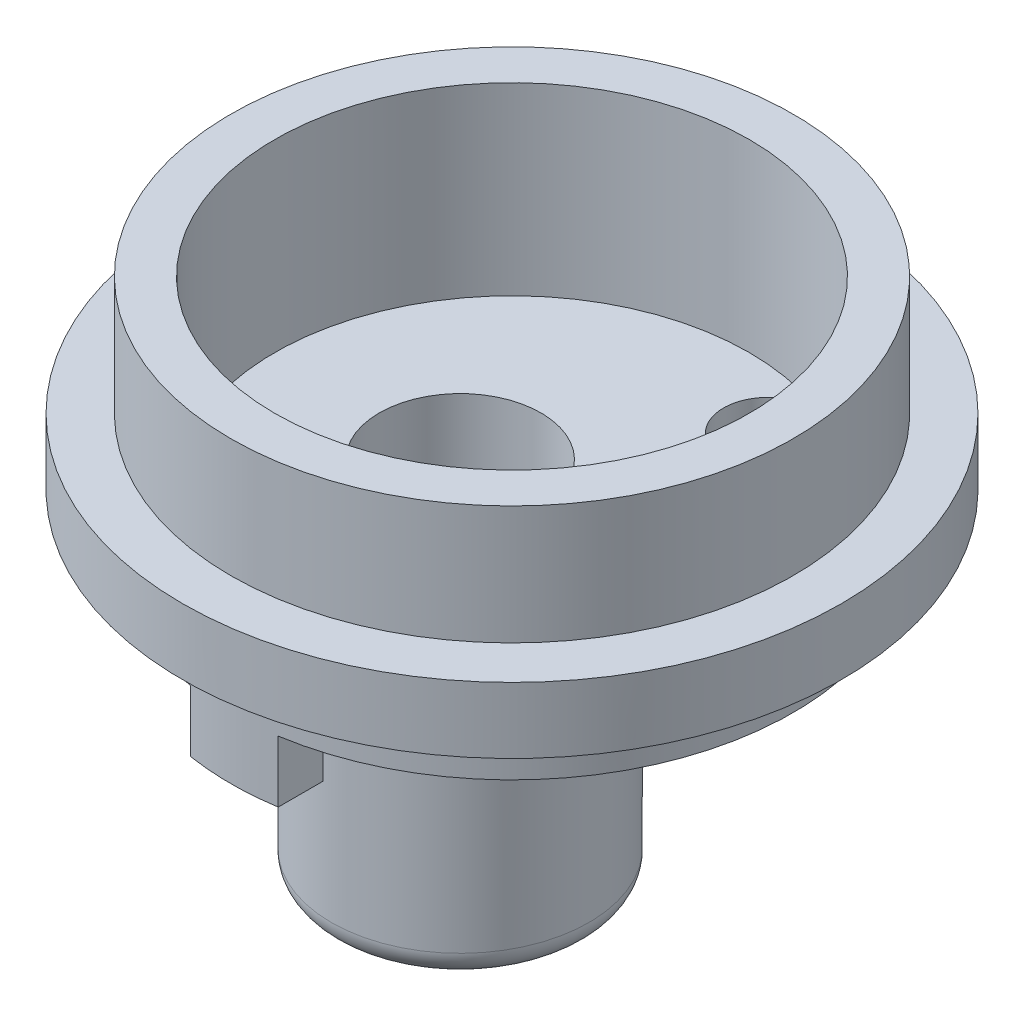
ISO-10303-21;
HEADER;
FILE_DESCRIPTION(('STEP AP214'),'2;1');
FILE_NAME('part.step','',(''),(''),'','','');
FILE_SCHEMA(('AUTOMOTIVE_DESIGN { 1 0 10303 214 1 1 1 1 }'));
ENDSEC;
DATA;
#1=APPLICATION_CONTEXT('core data for automotive mechanical design processes');
#2=APPLICATION_PROTOCOL_DEFINITION('international standard','automotive_design',2000,#1);
#3=PRODUCT_CONTEXT('',#1,'mechanical');
#4=PRODUCT('Part','Part','',(#3));
#5=PRODUCT_RELATED_PRODUCT_CATEGORY('part','',(#4));
#6=PRODUCT_DEFINITION_FORMATION('','',#4);
#7=PRODUCT_DEFINITION_CONTEXT('part definition',#1,'design');
#8=PRODUCT_DEFINITION('design','',#6,#7);
#9=PRODUCT_DEFINITION_SHAPE('','',#8);
#10=(LENGTH_UNIT() NAMED_UNIT(*) SI_UNIT(.MILLI.,.METRE.));
#11=(NAMED_UNIT(*) PLANE_ANGLE_UNIT() SI_UNIT($,.RADIAN.));
#12=(NAMED_UNIT(*) SI_UNIT($,.STERADIAN.) SOLID_ANGLE_UNIT());
#13=UNCERTAINTY_MEASURE_WITH_UNIT(LENGTH_MEASURE(1.E-05),#10,'distance_accuracy_value','');
#14=(GEOMETRIC_REPRESENTATION_CONTEXT(3) GLOBAL_UNCERTAINTY_ASSIGNED_CONTEXT((#13)) GLOBAL_UNIT_ASSIGNED_CONTEXT((#10,
#11,#12)) REPRESENTATION_CONTEXT('',''));
#15=CARTESIAN_POINT('',(0.,0.,0.));
#16=DIRECTION('',(0.,0.,1.));
#17=DIRECTION('',(1.,0.,0.));
#18=AXIS2_PLACEMENT_3D('',#15,#16,#17);
#19=CARTESIAN_POINT('',(0.,0.,0.));
#20=DIRECTION('',(0.,1.,0.));
#21=DIRECTION('',(0.,0.,1.));
#22=AXIS2_PLACEMENT_3D('',#19,#20,#21);
#23=PLANE('',#22);
#24=CARTESIAN_POINT('',(-1.4986,0.,0.));
#25=DIRECTION('',(0.,1.,0.));
#26=DIRECTION('',(0.,0.,1.));
#27=AXIS2_PLACEMENT_3D('',#24,#25,#26);
#28=CIRCLE('',#27,5.08);
#29=CARTESIAN_POINT('',(0.567898775765487,0.,4.64068775180573));
#30=VERTEX_POINT('',#29);
#31=CARTESIAN_POINT('',(0.567898775765488,0.,-4.64068775180573));
#32=VERTEX_POINT('',#31);
#33=EDGE_CURVE('E260',#30,#32,#28,.F.);
#34=ORIENTED_EDGE('',*,*,#33,.F.);
#35=CARTESIAN_POINT('',(2.28578474576272,0.,5.09911091230996));
#36=DIRECTION('',(0.,1.,0.));
#37=DIRECTION('',(0.,0.,1.));
#38=AXIS2_PLACEMENT_3D('',#35,#36,#37);
#39=CIRCLE('',#38,1.778);
#40=CARTESIAN_POINT('',(3.01307989214176,0.,6.72155529349949));
#41=VERTEX_POINT('',#40);
#42=EDGE_CURVE('E277',#30,#41,#39,.T.);
#43=ORIENTED_EDGE('',*,*,#42,.T.);
#44=CARTESIAN_POINT('',(0.,0.,0.));
#45=DIRECTION('',(0.,1.,0.));
#46=DIRECTION('',(0.,0.,1.));
#47=AXIS2_PLACEMENT_3D('',#44,#45,#46);
#48=CIRCLE('',#47,7.366);
#49=CARTESIAN_POINT('',(3.01307989214176,0.,-6.72155529349949));
#50=VERTEX_POINT('',#49);
#51=EDGE_CURVE('E273',#41,#50,#48,.T.);
#52=ORIENTED_EDGE('',*,*,#51,.T.);
#53=CARTESIAN_POINT('',(2.28578474576272,0.,-5.09911091230995));
#54=DIRECTION('',(0.,1.,0.));
#55=DIRECTION('',(0.,0.,1.));
#56=AXIS2_PLACEMENT_3D('',#53,#54,#55);
#57=CIRCLE('',#56,1.778);
#58=EDGE_CURVE('E275',#50,#32,#57,.T.);
#59=ORIENTED_EDGE('',*,*,#58,.T.);
#60=EDGE_LOOP('',(#34,#43,#52,#59));
#61=FACE_BOUND('',#60,.T.);
#62=CARTESIAN_POINT('',(0.,0.,0.));
#63=DIRECTION('',(0.,-1.,0.));
#64=DIRECTION('',(0.,0.,-1.));
#65=AXIS2_PLACEMENT_3D('',#62,#63,#64);
#66=CIRCLE('',#65,6.858);
#67=CARTESIAN_POINT('',(-1.27,0.,-6.73938157400217));
#68=VERTEX_POINT('',#67);
#69=CARTESIAN_POINT('',(1.27,0.,-6.73938157400217));
#70=VERTEX_POINT('',#69);
#71=EDGE_CURVE('E172',#68,#70,#66,.T.);
#72=ORIENTED_EDGE('',*,*,#71,.T.);
#73=DIRECTION('',(0.,0.,-1.));
#74=VECTOR('',#73,1.);
#75=CARTESIAN_POINT('',(1.27,0.,-6.73938157400217));
#76=LINE('',#75,#74);
#77=CARTESIAN_POINT('',(1.27,0.,-8.02816815967379));
#78=VERTEX_POINT('',#77);
#79=EDGE_CURVE('E170',#70,#78,#76,.T.);
#80=ORIENTED_EDGE('',*,*,#79,.T.);
#81=CARTESIAN_POINT('',(0.,0.,0.));
#82=DIRECTION('',(0.,1.,0.));
#83=DIRECTION('',(0.,0.,1.));
#84=AXIS2_PLACEMENT_3D('',#81,#82,#83);
#85=CIRCLE('',#84,8.128);
#86=CARTESIAN_POINT('',(1.27,0.,8.02816815967379));
#87=VERTEX_POINT('',#86);
#88=EDGE_CURVE('E156',#87,#78,#85,.T.);
#89=ORIENTED_EDGE('',*,*,#88,.F.);
#90=DIRECTION('',(0.,0.,-1.));
#91=VECTOR('',#90,1.);
#92=CARTESIAN_POINT('',(1.27,0.,8.02816815967379));
#93=LINE('',#92,#91);
#94=CARTESIAN_POINT('',(1.27,0.,6.73938157400217));
#95=VERTEX_POINT('',#94);
#96=EDGE_CURVE('E186',#87,#95,#93,.T.);
#97=ORIENTED_EDGE('',*,*,#96,.T.);
#98=CARTESIAN_POINT('',(0.,0.,0.));
#99=DIRECTION('',(0.,-1.,0.));
#100=DIRECTION('',(0.,0.,-1.));
#101=AXIS2_PLACEMENT_3D('',#98,#99,#100);
#102=CIRCLE('',#101,6.858);
#103=CARTESIAN_POINT('',(-1.27,0.,6.73938157400217));
#104=VERTEX_POINT('',#103);
#105=EDGE_CURVE('E197',#95,#104,#102,.T.);
#106=ORIENTED_EDGE('',*,*,#105,.T.);
#107=DIRECTION('',(0.,0.,-1.));
#108=VECTOR('',#107,1.);
#109=CARTESIAN_POINT('',(-1.27,0.,8.02816815967379));
#110=LINE('',#109,#108);
#111=CARTESIAN_POINT('',(-1.27,0.,8.02816815967379));
#112=VERTEX_POINT('',#111);
#113=EDGE_CURVE('E160',#112,#104,#110,.T.);
#114=ORIENTED_EDGE('',*,*,#113,.F.);
#115=CARTESIAN_POINT('',(-1.27,0.,-8.02816815967379));
#116=VERTEX_POINT('',#115);
#117=EDGE_CURVE('E255',#116,#112,#85,.T.);
#118=ORIENTED_EDGE('',*,*,#117,.F.);
#119=DIRECTION('',(0.,0.,-1.));
#120=VECTOR('',#119,1.);
#121=CARTESIAN_POINT('',(-1.27,0.,-6.73938157400217));
#122=LINE('',#121,#120);
#123=EDGE_CURVE('E149',#68,#116,#122,.T.);
#124=ORIENTED_EDGE('',*,*,#123,.F.);
#125=EDGE_LOOP('',(#72,#80,#89,#97,#106,#114,#118,#124));
#126=FACE_BOUND('',#125,.T.);
#127=ADVANCED_FACE('F36',(#61,#126),#23,.F.);
#128=CARTESIAN_POINT('',(0.,1.524,0.));
#129=DIRECTION('',(0.,-1.,0.));
#130=DIRECTION('',(0.,0.,-1.));
#131=AXIS2_PLACEMENT_3D('',#128,#129,#130);
#132=PLANE('',#131);
#133=CARTESIAN_POINT('',(-1.4986,1.524,0.));
#134=DIRECTION('',(0.,1.,0.));
#135=DIRECTION('',(-1.,0.,0.));
#136=AXIS2_PLACEMENT_3D('',#133,#134,#135);
#137=CIRCLE('',#136,2.33679999999999);
#138=CARTESIAN_POINT('',(-3.8354,1.524,0.));
#139=VERTEX_POINT('',#138);
#140=EDGE_CURVE('E227',#139,#139,#137,.T.);
#141=ORIENTED_EDGE('',*,*,#140,.F.);
#142=EDGE_LOOP('',(#141));
#143=FACE_BOUND('',#142,.T.);
#144=CARTESIAN_POINT('',(2.28578474576272,1.524,5.09911091230996));
#145=DIRECTION('',(0.,-1.,0.));
#146=DIRECTION('',(0.,0.,-1.));
#147=AXIS2_PLACEMENT_3D('',#144,#145,#146);
#148=CIRCLE('',#147,1.27);
#149=CARTESIAN_POINT('',(2.80528127889061,1.524,6.25799975601676));
#150=VERTEX_POINT('',#149);
#151=CARTESIAN_POINT('',(1.52890779661017,1.524,4.07928872984796));
#152=VERTEX_POINT('',#151);
#153=EDGE_CURVE('E210',#150,#152,#148,.T.);
#154=ORIENTED_EDGE('',*,*,#153,.T.);
#155=CARTESIAN_POINT('',(-1.4986,1.524,0.));
#156=DIRECTION('',(0.,1.,0.));
#157=DIRECTION('',(0.,0.,1.));
#158=AXIS2_PLACEMENT_3D('',#155,#156,#157);
#159=CIRCLE('',#158,5.08);
#160=CARTESIAN_POINT('',(1.52890779661017,1.524,-4.07928872984796));
#161=VERTEX_POINT('',#160);
#162=EDGE_CURVE('E213',#152,#161,#159,.T.);
#163=ORIENTED_EDGE('',*,*,#162,.T.);
#164=CARTESIAN_POINT('',(2.28578474576272,1.524,-5.09911091230995));
#165=DIRECTION('',(0.,1.,0.));
#166=DIRECTION('',(0.,0.,1.));
#167=AXIS2_PLACEMENT_3D('',#164,#165,#166);
#168=CIRCLE('',#167,1.27);
#169=CARTESIAN_POINT('',(2.80528127889061,1.524,-6.25799975601676));
#170=VERTEX_POINT('',#169);
#171=EDGE_CURVE('E216',#170,#161,#168,.T.);
#172=ORIENTED_EDGE('',*,*,#171,.F.);
#173=CARTESIAN_POINT('',(0.,1.524,0.));
#174=DIRECTION('',(0.,-1.,0.));
#175=DIRECTION('',(0.,0.,-1.));
#176=AXIS2_PLACEMENT_3D('',#173,#174,#175);
#177=CIRCLE('',#176,6.858);
#178=EDGE_CURVE('E239',#150,#170,#177,.T.);
#179=ORIENTED_EDGE('',*,*,#178,.F.);
#180=EDGE_LOOP('',(#154,#163,#172,#179));
#181=FACE_BOUND('',#180,.T.);
#182=ADVANCED_FACE('F314',(#143,#181),#132,.F.);
#183=CARTESIAN_POINT('',(0.,6.858,0.));
#184=DIRECTION('',(0.,-1.,0.));
#185=DIRECTION('',(0.,0.,-1.));
#186=AXIS2_PLACEMENT_3D('',#183,#184,#185);
#187=CYLINDRICAL_SURFACE('',#186,8.128);
#188=CARTESIAN_POINT('',(0.,1.524,0.));
#189=DIRECTION('',(0.,-1.,0.));
#190=DIRECTION('',(0.,0.,-1.));
#191=AXIS2_PLACEMENT_3D('',#188,#189,#190);
#192=CIRCLE('',#191,8.128);
#193=CARTESIAN_POINT('',(0.,1.524,-8.128));
#194=VERTEX_POINT('',#193);
#195=EDGE_CURVE('E251',#194,#194,#192,.T.);
#196=ORIENTED_EDGE('',*,*,#195,.T.);
#197=EDGE_LOOP('',(#196));
#198=FACE_BOUND('',#197,.T.);
#199=ORIENTED_EDGE('',*,*,#88,.T.);
#200=DIRECTION('',(0.,1.,0.));
#201=VECTOR('',#200,1.);
#202=CARTESIAN_POINT('',(1.27,-1.778,-8.02816815967379));
#203=LINE('',#202,#201);
#204=CARTESIAN_POINT('',(1.27,-1.778,-8.02816815967379));
#205=VERTEX_POINT('',#204);
#206=EDGE_CURVE('E152',#205,#78,#203,.T.);
#207=ORIENTED_EDGE('',*,*,#206,.F.);
#208=CARTESIAN_POINT('',(0.,-1.778,0.));
#209=DIRECTION('',(0.,-1.,0.));
#210=DIRECTION('',(0.,0.,-1.));
#211=AXIS2_PLACEMENT_3D('',#208,#209,#210);
#212=CIRCLE('',#211,8.128);
#213=CARTESIAN_POINT('',(-1.27,-1.778,-8.02816815967379));
#214=VERTEX_POINT('',#213);
#215=EDGE_CURVE('E138',#214,#205,#212,.T.);
#216=ORIENTED_EDGE('',*,*,#215,.F.);
#217=DIRECTION('',(0.,1.,0.));
#218=VECTOR('',#217,1.);
#219=CARTESIAN_POINT('',(-1.27,-1.778,-8.02816815967379));
#220=LINE('',#219,#218);
#221=EDGE_CURVE('E169',#214,#116,#220,.T.);
#222=ORIENTED_EDGE('',*,*,#221,.T.);
#223=ORIENTED_EDGE('',*,*,#117,.T.);
#224=DIRECTION('',(0.,1.,0.));
#225=VECTOR('',#224,1.);
#226=CARTESIAN_POINT('',(-1.27,-1.778,8.02816815967379));
#227=LINE('',#226,#225);
#228=CARTESIAN_POINT('',(-1.27,-1.778,8.02816815967379));
#229=VERTEX_POINT('',#228);
#230=EDGE_CURVE('E207',#229,#112,#227,.T.);
#231=ORIENTED_EDGE('',*,*,#230,.F.);
#232=CARTESIAN_POINT('',(0.,-1.778,0.));
#233=DIRECTION('',(0.,-1.,0.));
#234=DIRECTION('',(0.,0.,-1.));
#235=AXIS2_PLACEMENT_3D('',#232,#233,#234);
#236=CIRCLE('',#235,8.128);
#237=CARTESIAN_POINT('',(1.27,-1.778,8.02816815967379));
#238=VERTEX_POINT('',#237);
#239=EDGE_CURVE('E182',#238,#229,#236,.T.);
#240=ORIENTED_EDGE('',*,*,#239,.F.);
#241=DIRECTION('',(0.,1.,0.));
#242=VECTOR('',#241,1.);
#243=CARTESIAN_POINT('',(1.27,-1.778,8.02816815967379));
#244=LINE('',#243,#242);
#245=EDGE_CURVE('E194',#238,#87,#244,.T.);
#246=ORIENTED_EDGE('',*,*,#245,.T.);
#247=EDGE_LOOP('',(#199,#207,#216,#222,#223,#231,#240,#246));
#248=FACE_BOUND('',#247,.T.);
#249=ADVANCED_FACE('F153',(#198,#248),#187,.T.);
#250=CARTESIAN_POINT('',(-1.4986,-2.54,0.));
#251=DIRECTION('',(0.,1.,0.));
#252=DIRECTION('',(0.,0.,1.));
#253=AXIS2_PLACEMENT_3D('',#250,#251,#252);
#254=CYLINDRICAL_SURFACE('',#253,5.08);
#255=DIRECTION('',(0.,1.,0.));
#256=VECTOR('',#255,1.);
#257=CARTESIAN_POINT('',(1.52890779661017,-8.9662,4.07928872984796));
#258=LINE('',#257,#256);
#259=CARTESIAN_POINT('',(1.52890779661017,0.508,4.07928872984796));
#260=VERTEX_POINT('',#259);
#261=EDGE_CURVE('E225',#260,#152,#258,.T.);
#262=ORIENTED_EDGE('',*,*,#261,.F.);
#263=CARTESIAN_POINT('',(0.567898775765488,0.,4.64068775180573));
#264=CARTESIAN_POINT('',(0.618864964756393,5.12373952471222E-05,4.61801161541345));
#265=CARTESIAN_POINT('',(0.669077863503208,0.00553166204909815,4.59462833172186));
#266=CARTESIAN_POINT('',(0.766715495825451,0.0249706184832816,4.54726271334381));
#267=CARTESIAN_POINT('',(0.814169285684297,0.038810230688748,4.52329322552336));
#268=CARTESIAN_POINT('',(0.941170085100346,0.0854665664421088,4.45671525964496));
#269=CARTESIAN_POINT('',(1.01800450523612,0.124727188123649,4.41365014820112));
#270=CARTESIAN_POINT('',(1.16492275554147,0.21424231053805,4.32659484056449));
#271=CARTESIAN_POINT('',(1.23494680683312,0.264583360923871,4.28259997503994));
#272=CARTESIAN_POINT('',(1.37918595530417,0.377555296614401,4.18726831558202));
#273=CARTESIAN_POINT('',(1.45268033128906,0.44092690877456,4.13574536153834));
#274=CARTESIAN_POINT('',(1.52612075642525,0.505546294935492,4.08135604999621));
#275=CARTESIAN_POINT('',(1.52751454136693,0.506773155422019,4.08032273697647));
#276=CARTESIAN_POINT('',(1.52890779661017,0.508,4.07928872984796));
#277=B_SPLINE_CURVE_WITH_KNOTS('',3,(#263,#264,#265,#266,#267,#268,#269,#270,#271,#272,#273,
#274,#275,#276),.UNSPECIFIED.,.F.,.F.,(4,2,2,2,2,2,4),(0.,0.166504667171272,0.3306946298291,
0.618403010419728,0.908443915602081,1.23784315485636,1.24421810640599),.UNSPECIFIED.);
#278=EDGE_CURVE('E282',#260,#30,#277,.F.);
#279=ORIENTED_EDGE('',*,*,#278,.T.);
#280=ORIENTED_EDGE('',*,*,#33,.T.);
#281=CARTESIAN_POINT('',(0.567898775765488,0.,-4.64068775180573));
#282=CARTESIAN_POINT('',(0.618864964756394,5.12373952469472E-05,-4.61801161541345));
#283=CARTESIAN_POINT('',(0.66907786350321,0.00553166204909828,-4.59462833172186));
#284=CARTESIAN_POINT('',(0.766715495825454,0.0249706184832823,-4.54726271334381));
#285=CARTESIAN_POINT('',(0.814169285684299,0.0388102306887487,-4.52329322552336));
#286=CARTESIAN_POINT('',(0.941170085100345,0.0854665664421085,-4.45671525964496));
#287=CARTESIAN_POINT('',(1.01800450523612,0.124727188123647,-4.41365014820112));
#288=CARTESIAN_POINT('',(1.16492275554147,0.214242310538049,-4.32659484056449));
#289=CARTESIAN_POINT('',(1.23494680683311,0.264583360923875,-4.28259997503994));
#290=CARTESIAN_POINT('',(1.37918595530417,0.377555296614393,-4.18726831558202));
#291=CARTESIAN_POINT('',(1.45268033128907,0.440926908774531,-4.13574536153833));
#292=CARTESIAN_POINT('',(1.52612075642525,0.50554629493549,-4.08135604999621));
#293=CARTESIAN_POINT('',(1.52751454136693,0.506773155422018,-4.08032273697647));
#294=CARTESIAN_POINT('',(1.52890779661017,0.508,-4.07928872984796));
#295=B_SPLINE_CURVE_WITH_KNOTS('',3,(#281,#282,#283,#284,#285,#286,#287,#288,#289,#290,#291,
#292,#293,#294),.UNSPECIFIED.,.F.,.F.,(4,2,2,2,2,2,4),(0.,0.166504667171275,0.3306946298291,
0.618403010419724,0.908443915602075,1.23784315485636,1.24421810640599),.UNSPECIFIED.);
#296=CARTESIAN_POINT('',(1.52890779661017,0.508,-4.07928872984796));
#297=VERTEX_POINT('',#296);
#298=EDGE_CURVE('E51',#32,#297,#295,.T.);
#299=ORIENTED_EDGE('',*,*,#298,.T.);
#300=DIRECTION('',(0.,1.,0.));
#301=VECTOR('',#300,1.);
#302=CARTESIAN_POINT('',(1.52890779661017,-8.9662,-4.07928872984796));
#303=LINE('',#302,#301);
#304=EDGE_CURVE('E223',#297,#161,#303,.T.);
#305=ORIENTED_EDGE('',*,*,#304,.T.);
#306=ORIENTED_EDGE('',*,*,#162,.F.);
#307=EDGE_LOOP('',(#262,#279,#280,#299,#305,#306));
#308=FACE_BOUND('',#307,.T.);
#309=CARTESIAN_POINT('',(-1.4986,-2.54,0.));
#310=DIRECTION('',(0.,-1.,0.));
#311=DIRECTION('',(0.,0.,-1.));
#312=AXIS2_PLACEMENT_3D('',#309,#310,#311);
#313=CIRCLE('',#312,5.08);
#314=CARTESIAN_POINT('',(-1.4986,-2.54,-5.08));
#315=VERTEX_POINT('',#314);
#316=EDGE_CURVE('E252',#315,#315,#313,.T.);
#317=ORIENTED_EDGE('',*,*,#316,.F.);
#318=EDGE_LOOP('',(#317));
#319=FACE_BOUND('',#318,.T.);
#320=ADVANCED_FACE('F299',(#308,#319),#254,.T.);
#321=CARTESIAN_POINT('',(-1.4986,-2.54,0.));
#322=DIRECTION('',(0.,-1.,0.));
#323=DIRECTION('',(0.,0.,-1.));
#324=AXIS2_PLACEMENT_3D('',#321,#322,#323);
#325=PLANE('',#324);
#326=CARTESIAN_POINT('',(-1.4986,-2.54,0.));
#327=DIRECTION('',(0.,-1.,0.));
#328=DIRECTION('',(0.,0.,-1.));
#329=AXIS2_PLACEMENT_3D('',#326,#327,#328);
#330=CIRCLE('',#329,3.72467038944253);
#331=CARTESIAN_POINT('',(-1.4986,-2.54,-3.72467038944253));
#332=VERTEX_POINT('',#331);
#333=EDGE_CURVE('E263',#332,#332,#330,.T.);
#334=ORIENTED_EDGE('',*,*,#333,.F.);
#335=EDGE_LOOP('',(#334));
#336=FACE_BOUND('',#335,.T.);
#337=ORIENTED_EDGE('',*,*,#316,.T.);
#338=EDGE_LOOP('',(#337));
#339=FACE_BOUND('',#338,.T.);
#340=ADVANCED_FACE('F304',(#336,#339),#325,.T.);
#341=CARTESIAN_POINT('',(-1.4986,-8.9662,0.));
#342=DIRECTION('',(0.,1.,0.));
#343=DIRECTION('',(0.,0.,1.));
#344=AXIS2_PLACEMENT_3D('',#341,#342,#343);
#345=CYLINDRICAL_SURFACE('',#344,3.72467038944253);
#346=CARTESIAN_POINT('',(-1.4986,-8.2042,0.));
#347=DIRECTION('',(0.,1.,0.));
#348=DIRECTION('',(0.,0.,1.));
#349=AXIS2_PLACEMENT_3D('',#346,#347,#348);
#350=CIRCLE('',#349,3.72467038944253);
#351=CARTESIAN_POINT('',(-1.4986,-8.2042,3.72467038944253));
#352=VERTEX_POINT('',#351);
#353=EDGE_CURVE('E44',#352,#352,#350,.T.);
#354=ORIENTED_EDGE('',*,*,#353,.T.);
#355=EDGE_LOOP('',(#354));
#356=FACE_BOUND('',#355,.T.);
#357=ORIENTED_EDGE('',*,*,#333,.T.);
#358=EDGE_LOOP('',(#357));
#359=FACE_BOUND('',#358,.T.);
#360=ADVANCED_FACE('F349',(#356,#359),#345,.T.);
#361=CARTESIAN_POINT('',(-1.4986,-8.9662,0.));
#362=DIRECTION('',(0.,1.,0.));
#363=DIRECTION('',(0.,0.,1.));
#364=AXIS2_PLACEMENT_3D('',#361,#362,#363);
#365=PLANE('',#364);
#366=CARTESIAN_POINT('',(-1.4986,-8.9662,0.));
#367=DIRECTION('',(0.,1.,0.));
#368=DIRECTION('',(0.,0.,1.));
#369=AXIS2_PLACEMENT_3D('',#366,#367,#368);
#370=CIRCLE('',#369,2.96267038944253);
#371=CARTESIAN_POINT('',(-1.4986,-8.9662,2.96267038944253));
#372=VERTEX_POINT('',#371);
#373=EDGE_CURVE('E11',#372,#372,#370,.F.);
#374=ORIENTED_EDGE('',*,*,#373,.T.);
#375=EDGE_LOOP('',(#374));
#376=FACE_BOUND('',#375,.T.);
#377=CARTESIAN_POINT('',(-1.4986,-8.9662,0.));
#378=DIRECTION('',(0.,1.,0.));
#379=DIRECTION('',(-1.,0.,0.));
#380=AXIS2_PLACEMENT_3D('',#377,#378,#379);
#381=CIRCLE('',#380,1.9304);
#382=CARTESIAN_POINT('',(-3.429,-8.9662,0.));
#383=VERTEX_POINT('',#382);
#384=EDGE_CURVE('E230',#383,#383,#381,.T.);
#385=ORIENTED_EDGE('',*,*,#384,.T.);
#386=EDGE_LOOP('',(#385));
#387=FACE_BOUND('',#386,.T.);
#388=ADVANCED_FACE('F340',(#376,#387),#365,.F.);
#389=CARTESIAN_POINT('',(0.,3.429,0.));
#390=DIRECTION('',(0.,1.,0.));
#391=DIRECTION('',(0.,0.,1.));
#392=AXIS2_PLACEMENT_3D('',#389,#390,#391);
#393=PLANE('',#392);
#394=CARTESIAN_POINT('',(0.,3.429,0.));
#395=DIRECTION('',(0.,1.,0.));
#396=DIRECTION('',(0.,0.,1.));
#397=AXIS2_PLACEMENT_3D('',#394,#395,#396);
#398=CIRCLE('',#397,9.525);
#399=CARTESIAN_POINT('',(0.,3.429,9.525));
#400=VERTEX_POINT('',#399);
#401=EDGE_CURVE('E248',#400,#400,#398,.F.);
#402=ORIENTED_EDGE('',*,*,#401,.F.);
#403=EDGE_LOOP('',(#402));
#404=FACE_BOUND('',#403,.T.);
#405=CARTESIAN_POINT('',(0.,3.429,0.));
#406=DIRECTION('',(0.,1.,0.));
#407=DIRECTION('',(0.,0.,1.));
#408=AXIS2_PLACEMENT_3D('',#405,#406,#407);
#409=CIRCLE('',#408,8.128);
#410=CARTESIAN_POINT('',(0.,3.429,8.128));
#411=VERTEX_POINT('',#410);
#412=EDGE_CURVE('E256',#411,#411,#409,.T.);
#413=ORIENTED_EDGE('',*,*,#412,.F.);
#414=EDGE_LOOP('',(#413));
#415=FACE_BOUND('',#414,.T.);
#416=ADVANCED_FACE('F337',(#404,#415),#393,.T.);
#417=CARTESIAN_POINT('',(0.,1.524,0.));
#418=DIRECTION('',(0.,-1.,0.));
#419=DIRECTION('',(0.,0.,-1.));
#420=AXIS2_PLACEMENT_3D('',#417,#418,#419);
#421=PLANE('',#420);
#422=CARTESIAN_POINT('',(0.,1.524,0.));
#423=DIRECTION('',(0.,-1.,0.));
#424=DIRECTION('',(0.,0.,-1.));
#425=AXIS2_PLACEMENT_3D('',#422,#423,#424);
#426=CIRCLE('',#425,9.525);
#427=CARTESIAN_POINT('',(0.,1.524,-9.525));
#428=VERTEX_POINT('',#427);
#429=EDGE_CURVE('E243',#428,#428,#426,.T.);
#430=ORIENTED_EDGE('',*,*,#429,.T.);
#431=EDGE_LOOP('',(#430));
#432=FACE_BOUND('',#431,.T.);
#433=ORIENTED_EDGE('',*,*,#195,.F.);
#434=EDGE_LOOP('',(#433));
#435=FACE_BOUND('',#434,.T.);
#436=ADVANCED_FACE('F339',(#432,#435),#421,.T.);
#437=CARTESIAN_POINT('',(0.,33.7987683632075,0.));
#438=DIRECTION('',(0.,-1.,0.));
#439=DIRECTION('',(0.,0.,-1.));
#440=AXIS2_PLACEMENT_3D('',#437,#438,#439);
#441=CYLINDRICAL_SURFACE('',#440,9.525);
#442=ORIENTED_EDGE('',*,*,#429,.F.);
#443=EDGE_LOOP('',(#442));
#444=FACE_BOUND('',#443,.T.);
#445=ORIENTED_EDGE('',*,*,#401,.T.);
#446=EDGE_LOOP('',(#445));
#447=FACE_BOUND('',#446,.T.);
#448=ADVANCED_FACE('F311',(#444,#447),#441,.T.);
#449=CARTESIAN_POINT('',(0.,6.858,0.));
#450=DIRECTION('',(0.,1.,0.));
#451=DIRECTION('',(0.,0.,1.));
#452=AXIS2_PLACEMENT_3D('',#449,#450,#451);
#453=PLANE('',#452);
#454=CARTESIAN_POINT('',(0.,6.858,0.));
#455=DIRECTION('',(0.,-1.,0.));
#456=DIRECTION('',(0.,0.,-1.));
#457=AXIS2_PLACEMENT_3D('',#454,#455,#456);
#458=CIRCLE('',#457,6.858);
#459=CARTESIAN_POINT('',(0.,6.858,-6.858));
#460=VERTEX_POINT('',#459);
#461=EDGE_CURVE('E240',#460,#460,#458,.T.);
#462=ORIENTED_EDGE('',*,*,#461,.T.);
#463=EDGE_LOOP('',(#462));
#464=FACE_BOUND('',#463,.T.);
#465=CARTESIAN_POINT('',(0.,6.858,0.));
#466=DIRECTION('',(0.,1.,0.));
#467=DIRECTION('',(0.,0.,1.));
#468=AXIS2_PLACEMENT_3D('',#465,#466,#467);
#469=CIRCLE('',#468,8.128);
#470=CARTESIAN_POINT('',(0.,6.858,8.128));
#471=VERTEX_POINT('',#470);
#472=EDGE_CURVE('E257',#471,#471,#469,.T.);
#473=ORIENTED_EDGE('',*,*,#472,.T.);
#474=EDGE_LOOP('',(#473));
#475=FACE_BOUND('',#474,.T.);
#476=ADVANCED_FACE('F306',(#464,#475),#453,.T.);
#477=ORIENTED_EDGE('',*,*,#412,.T.);
#478=EDGE_LOOP('',(#477));
#479=FACE_BOUND('',#478,.T.);
#480=ORIENTED_EDGE('',*,*,#472,.F.);
#481=EDGE_LOOP('',(#480));
#482=FACE_BOUND('',#481,.T.);
#483=ADVANCED_FACE('F310',(#479,#482),#187,.T.);
#484=CARTESIAN_POINT('',(0.,6.858,0.));
#485=DIRECTION('',(0.,-1.,0.));
#486=DIRECTION('',(0.,0.,-1.));
#487=AXIS2_PLACEMENT_3D('',#484,#485,#486);
#488=CYLINDRICAL_SURFACE('',#487,6.858);
#489=ORIENTED_EDGE('',*,*,#461,.F.);
#490=EDGE_LOOP('',(#489));
#491=FACE_BOUND('',#490,.T.);
#492=DIRECTION('',(0.,1.,0.));
#493=VECTOR('',#492,1.);
#494=CARTESIAN_POINT('',(2.80528127889061,-8.9662,-6.25799975601676));
#495=LINE('',#494,#493);
#496=CARTESIAN_POINT('',(2.80528127889061,0.508,-6.25799975601676));
#497=VERTEX_POINT('',#496);
#498=EDGE_CURVE('E221',#497,#170,#495,.T.);
#499=ORIENTED_EDGE('',*,*,#498,.F.);
#500=CARTESIAN_POINT('',(0.,0.508,0.));
#501=DIRECTION('',(0.,1.,0.));
#502=DIRECTION('',(0.,0.,1.));
#503=AXIS2_PLACEMENT_3D('',#500,#501,#502);
#504=CIRCLE('',#503,6.858);
#505=CARTESIAN_POINT('',(2.80528127889061,0.508,6.25799975601676));
#506=VERTEX_POINT('',#505);
#507=EDGE_CURVE('E280',#497,#506,#504,.F.);
#508=ORIENTED_EDGE('',*,*,#507,.T.);
#509=DIRECTION('',(0.,1.,0.));
#510=VECTOR('',#509,1.);
#511=CARTESIAN_POINT('',(2.80528127889061,-8.9662,6.25799975601676));
#512=LINE('',#511,#510);
#513=EDGE_CURVE('E219',#506,#150,#512,.T.);
#514=ORIENTED_EDGE('',*,*,#513,.T.);
#515=ORIENTED_EDGE('',*,*,#178,.T.);
#516=EDGE_LOOP('',(#499,#508,#514,#515));
#517=FACE_BOUND('',#516,.T.);
#518=ADVANCED_FACE('F324',(#491,#517),#488,.F.);
#519=CARTESIAN_POINT('',(-1.4986,5.36518646205091,0.));
#520=DIRECTION('',(0.,1.,0.));
#521=DIRECTION('',(-1.,0.,0.));
#522=AXIS2_PLACEMENT_3D('',#519,#520,#521);
#523=CYLINDRICAL_SURFACE('',#522,2.33679999999999);
#524=CARTESIAN_POINT('',(-1.4986,-3.81,0.));
#525=DIRECTION('',(0.,1.,0.));
#526=DIRECTION('',(-1.,0.,0.));
#527=AXIS2_PLACEMENT_3D('',#524,#525,#526);
#528=CIRCLE('',#527,2.3368);
#529=CARTESIAN_POINT('',(-3.8354,-3.81,0.));
#530=VERTEX_POINT('',#529);
#531=EDGE_CURVE('E236',#530,#530,#528,.T.);
#532=ORIENTED_EDGE('',*,*,#531,.F.);
#533=EDGE_LOOP('',(#532));
#534=FACE_BOUND('',#533,.T.);
#535=ORIENTED_EDGE('',*,*,#140,.T.);
#536=EDGE_LOOP('',(#535));
#537=FACE_BOUND('',#536,.T.);
#538=ADVANCED_FACE('F329',(#534,#537),#523,.F.);
#539=CARTESIAN_POINT('',(-1.4986,-3.81,0.));
#540=DIRECTION('',(0.,1.,0.));
#541=DIRECTION('',(-1.,0.,0.));
#542=AXIS2_PLACEMENT_3D('',#539,#540,#541);
#543=CONICAL_SURFACE('',#542,2.33679999999999,0.132481438347531);
#544=CARTESIAN_POINT('',(-1.4986,-6.85963169164882,0.));
#545=DIRECTION('',(0.,1.,0.));
#546=DIRECTION('',(-1.,0.,0.));
#547=AXIS2_PLACEMENT_3D('',#544,#545,#546);
#548=CIRCLE('',#547,1.9304);
#549=CARTESIAN_POINT('',(-3.429,-6.85963169164882,0.));
#550=VERTEX_POINT('',#549);
#551=EDGE_CURVE('E233',#550,#550,#548,.T.);
#552=ORIENTED_EDGE('',*,*,#551,.F.);
#553=EDGE_LOOP('',(#552));
#554=FACE_BOUND('',#553,.T.);
#555=ORIENTED_EDGE('',*,*,#531,.T.);
#556=EDGE_LOOP('',(#555));
#557=FACE_BOUND('',#556,.T.);
#558=ADVANCED_FACE('F432',(#554,#557),#543,.F.);
#559=CARTESIAN_POINT('',(-1.4986,5.36518646205091,0.));
#560=DIRECTION('',(0.,1.,0.));
#561=DIRECTION('',(-1.,0.,0.));
#562=AXIS2_PLACEMENT_3D('',#559,#560,#561);
#563=CYLINDRICAL_SURFACE('',#562,1.9304);
#564=ORIENTED_EDGE('',*,*,#384,.F.);
#565=EDGE_LOOP('',(#564));
#566=FACE_BOUND('',#565,.T.);
#567=ORIENTED_EDGE('',*,*,#551,.T.);
#568=EDGE_LOOP('',(#567));
#569=FACE_BOUND('',#568,.T.);
#570=ADVANCED_FACE('F428',(#566,#569),#563,.F.);
#571=CARTESIAN_POINT('',(2.28578474576272,-8.9662,5.09911091230996));
#572=DIRECTION('',(0.,1.,0.));
#573=DIRECTION('',(0.,0.,1.));
#574=AXIS2_PLACEMENT_3D('',#571,#572,#573);
#575=CYLINDRICAL_SURFACE('',#574,1.27);
#576=ORIENTED_EDGE('',*,*,#513,.F.);
#577=CARTESIAN_POINT('',(2.28578474576272,0.508,5.09911091230996));
#578=DIRECTION('',(0.,1.,0.));
#579=DIRECTION('',(0.,0.,1.));
#580=AXIS2_PLACEMENT_3D('',#577,#578,#579);
#581=CIRCLE('',#580,1.27);
#582=EDGE_CURVE('E266',#506,#260,#581,.F.);
#583=ORIENTED_EDGE('',*,*,#582,.T.);
#584=ORIENTED_EDGE('',*,*,#261,.T.);
#585=ORIENTED_EDGE('',*,*,#153,.F.);
#586=EDGE_LOOP('',(#576,#583,#584,#585));
#587=FACE_BOUND('',#586,.T.);
#588=ADVANCED_FACE('F425',(#587),#575,.F.);
#589=CARTESIAN_POINT('',(2.28578474576272,-8.9662,-5.09911091230995));
#590=DIRECTION('',(0.,1.,0.));
#591=DIRECTION('',(0.,0.,1.));
#592=AXIS2_PLACEMENT_3D('',#589,#590,#591);
#593=CYLINDRICAL_SURFACE('',#592,1.27);
#594=ORIENTED_EDGE('',*,*,#304,.F.);
#595=CARTESIAN_POINT('',(2.28578474576272,0.508,-5.09911091230995));
#596=DIRECTION('',(0.,1.,0.));
#597=DIRECTION('',(0.,0.,1.));
#598=AXIS2_PLACEMENT_3D('',#595,#596,#597);
#599=CIRCLE('',#598,1.27);
#600=EDGE_CURVE('E58',#297,#497,#599,.F.);
#601=ORIENTED_EDGE('',*,*,#600,.T.);
#602=ORIENTED_EDGE('',*,*,#498,.T.);
#603=ORIENTED_EDGE('',*,*,#171,.T.);
#604=EDGE_LOOP('',(#594,#601,#602,#603));
#605=FACE_BOUND('',#604,.T.);
#606=ADVANCED_FACE('F421',(#605),#593,.F.);
#607=CARTESIAN_POINT('',(-1.27,-1.778,8.02816815967379));
#608=DIRECTION('',(1.,0.,0.));
#609=DIRECTION('',(0.,0.,-1.));
#610=AXIS2_PLACEMENT_3D('',#607,#608,#609);
#611=PLANE('',#610);
#612=ORIENTED_EDGE('',*,*,#113,.T.);
#613=DIRECTION('',(0.,1.,0.));
#614=VECTOR('',#613,1.);
#615=CARTESIAN_POINT('',(-1.27,-1.778,6.73938157400217));
#616=LINE('',#615,#614);
#617=CARTESIAN_POINT('',(-1.27,-1.778,6.73938157400217));
#618=VERTEX_POINT('',#617);
#619=EDGE_CURVE('E205',#618,#104,#616,.T.);
#620=ORIENTED_EDGE('',*,*,#619,.F.);
#621=DIRECTION('',(0.,0.,-1.));
#622=VECTOR('',#621,1.);
#623=CARTESIAN_POINT('',(-1.27,-1.778,8.02816815967379));
#624=LINE('',#623,#622);
#625=EDGE_CURVE('E185',#229,#618,#624,.T.);
#626=ORIENTED_EDGE('',*,*,#625,.F.);
#627=ORIENTED_EDGE('',*,*,#230,.T.);
#628=EDGE_LOOP('',(#612,#620,#626,#627));
#629=FACE_BOUND('',#628,.T.);
#630=ADVANCED_FACE('F417',(#629),#611,.F.);
#631=CARTESIAN_POINT('',(0.,-1.778,0.));
#632=DIRECTION('',(0.,1.,0.));
#633=DIRECTION('',(0.,0.,1.));
#634=AXIS2_PLACEMENT_3D('',#631,#632,#633);
#635=CYLINDRICAL_SURFACE('',#634,6.858);
#636=ORIENTED_EDGE('',*,*,#105,.F.);
#637=DIRECTION('',(0.,1.,0.));
#638=VECTOR('',#637,1.);
#639=CARTESIAN_POINT('',(1.27,-1.778,6.73938157400217));
#640=LINE('',#639,#638);
#641=CARTESIAN_POINT('',(1.27,-1.778,6.73938157400217));
#642=VERTEX_POINT('',#641);
#643=EDGE_CURVE('E203',#642,#95,#640,.T.);
#644=ORIENTED_EDGE('',*,*,#643,.F.);
#645=CARTESIAN_POINT('',(0.,-1.778,0.));
#646=DIRECTION('',(0.,-1.,0.));
#647=DIRECTION('',(0.,0.,-1.));
#648=AXIS2_PLACEMENT_3D('',#645,#646,#647);
#649=CIRCLE('',#648,6.858);
#650=EDGE_CURVE('E188',#642,#618,#649,.T.);
#651=ORIENTED_EDGE('',*,*,#650,.T.);
#652=ORIENTED_EDGE('',*,*,#619,.T.);
#653=EDGE_LOOP('',(#636,#644,#651,#652));
#654=FACE_BOUND('',#653,.T.);
#655=ADVANCED_FACE('F413',(#654),#635,.F.);
#656=CARTESIAN_POINT('',(1.27,-1.778,8.02816815967379));
#657=DIRECTION('',(1.,0.,0.));
#658=DIRECTION('',(0.,0.,-1.));
#659=AXIS2_PLACEMENT_3D('',#656,#657,#658);
#660=PLANE('',#659);
#661=ORIENTED_EDGE('',*,*,#96,.F.);
#662=ORIENTED_EDGE('',*,*,#245,.F.);
#663=DIRECTION('',(0.,0.,-1.));
#664=VECTOR('',#663,1.);
#665=CARTESIAN_POINT('',(1.27,-1.778,8.02816815967379));
#666=LINE('',#665,#664);
#667=EDGE_CURVE('E191',#238,#642,#666,.T.);
#668=ORIENTED_EDGE('',*,*,#667,.T.);
#669=ORIENTED_EDGE('',*,*,#643,.T.);
#670=EDGE_LOOP('',(#661,#662,#668,#669));
#671=FACE_BOUND('',#670,.T.);
#672=ADVANCED_FACE('F409',(#671),#660,.T.);
#673=CARTESIAN_POINT('',(0.,-1.778,0.));
#674=DIRECTION('',(0.,-1.,0.));
#675=DIRECTION('',(0.,0.,-1.));
#676=AXIS2_PLACEMENT_3D('',#673,#674,#675);
#677=PLANE('',#676);
#678=ORIENTED_EDGE('',*,*,#239,.T.);
#679=ORIENTED_EDGE('',*,*,#625,.T.);
#680=ORIENTED_EDGE('',*,*,#650,.F.);
#681=ORIENTED_EDGE('',*,*,#667,.F.);
#682=EDGE_LOOP('',(#678,#679,#680,#681));
#683=FACE_BOUND('',#682,.T.);
#684=ADVANCED_FACE('F406',(#683),#677,.T.);
#685=CARTESIAN_POINT('',(1.27,-1.778,-6.73938157400217));
#686=DIRECTION('',(1.,0.,0.));
#687=DIRECTION('',(0.,0.,-1.));
#688=AXIS2_PLACEMENT_3D('',#685,#686,#687);
#689=PLANE('',#688);
#690=ORIENTED_EDGE('',*,*,#79,.F.);
#691=DIRECTION('',(0.,1.,0.));
#692=VECTOR('',#691,1.);
#693=CARTESIAN_POINT('',(1.27,-1.778,-6.73938157400217));
#694=LINE('',#693,#692);
#695=CARTESIAN_POINT('',(1.27,-1.778,-6.73938157400217));
#696=VERTEX_POINT('',#695);
#697=EDGE_CURVE('E161',#696,#70,#694,.T.);
#698=ORIENTED_EDGE('',*,*,#697,.F.);
#699=DIRECTION('',(0.,0.,-1.));
#700=VECTOR('',#699,1.);
#701=CARTESIAN_POINT('',(1.27,-1.778,-6.73938157400217));
#702=LINE('',#701,#700);
#703=EDGE_CURVE('E143',#696,#205,#702,.T.);
#704=ORIENTED_EDGE('',*,*,#703,.T.);
#705=ORIENTED_EDGE('',*,*,#206,.T.);
#706=EDGE_LOOP('',(#690,#698,#704,#705));
#707=FACE_BOUND('',#706,.T.);
#708=ADVANCED_FACE('F163',(#707),#689,.T.);
#709=CARTESIAN_POINT('',(0.,-1.778,0.));
#710=DIRECTION('',(0.,1.,0.));
#711=DIRECTION('',(0.,0.,1.));
#712=AXIS2_PLACEMENT_3D('',#709,#710,#711);
#713=CYLINDRICAL_SURFACE('',#712,6.858);
#714=ORIENTED_EDGE('',*,*,#71,.F.);
#715=DIRECTION('',(0.,1.,0.));
#716=VECTOR('',#715,1.);
#717=CARTESIAN_POINT('',(-1.27,-1.778,-6.73938157400217));
#718=LINE('',#717,#716);
#719=CARTESIAN_POINT('',(-1.27,-1.778,-6.73938157400217));
#720=VERTEX_POINT('',#719);
#721=EDGE_CURVE('E179',#720,#68,#718,.T.);
#722=ORIENTED_EDGE('',*,*,#721,.F.);
#723=CARTESIAN_POINT('',(0.,-1.778,0.));
#724=DIRECTION('',(0.,-1.,0.));
#725=DIRECTION('',(0.,0.,-1.));
#726=AXIS2_PLACEMENT_3D('',#723,#724,#725);
#727=CIRCLE('',#726,6.858);
#728=EDGE_CURVE('E164',#720,#696,#727,.T.);
#729=ORIENTED_EDGE('',*,*,#728,.T.);
#730=ORIENTED_EDGE('',*,*,#697,.T.);
#731=EDGE_LOOP('',(#714,#722,#729,#730));
#732=FACE_BOUND('',#731,.T.);
#733=ADVANCED_FACE('F397',(#732),#713,.F.);
#734=CARTESIAN_POINT('',(-1.27,-1.778,-6.73938157400217));
#735=DIRECTION('',(1.,0.,0.));
#736=DIRECTION('',(0.,0.,-1.));
#737=AXIS2_PLACEMENT_3D('',#734,#735,#736);
#738=PLANE('',#737);
#739=ORIENTED_EDGE('',*,*,#123,.T.);
#740=ORIENTED_EDGE('',*,*,#221,.F.);
#741=DIRECTION('',(0.,0.,-1.));
#742=VECTOR('',#741,1.);
#743=CARTESIAN_POINT('',(-1.27,-1.778,-6.73938157400217));
#744=LINE('',#743,#742);
#745=EDGE_CURVE('E146',#720,#214,#744,.T.);
#746=ORIENTED_EDGE('',*,*,#745,.F.);
#747=ORIENTED_EDGE('',*,*,#721,.T.);
#748=EDGE_LOOP('',(#739,#740,#746,#747));
#749=FACE_BOUND('',#748,.T.);
#750=ADVANCED_FACE('F391',(#749),#738,.F.);
#751=CARTESIAN_POINT('',(0.,-1.778,0.));
#752=DIRECTION('',(0.,-1.,0.));
#753=DIRECTION('',(0.,0.,-1.));
#754=AXIS2_PLACEMENT_3D('',#751,#752,#753);
#755=PLANE('',#754);
#756=ORIENTED_EDGE('',*,*,#215,.T.);
#757=ORIENTED_EDGE('',*,*,#703,.F.);
#758=ORIENTED_EDGE('',*,*,#728,.F.);
#759=ORIENTED_EDGE('',*,*,#745,.T.);
#760=EDGE_LOOP('',(#756,#757,#758,#759));
#761=FACE_BOUND('',#760,.T.);
#762=ADVANCED_FACE('F140',(#761),#755,.T.);
#763=CARTESIAN_POINT('',(2.28578474576272,0.508,-5.09911091230995));
#764=DIRECTION('',(0.,1.,0.));
#765=DIRECTION('',(0.,0.,1.));
#766=AXIS2_PLACEMENT_3D('',#763,#764,#765);
#767=TOROIDAL_SURFACE('',#766,1.778,0.508);
#768=ORIENTED_EDGE('',*,*,#298,.F.);
#769=ORIENTED_EDGE('',*,*,#58,.F.);
#770=CARTESIAN_POINT('',(3.01307989214176,0.508,-6.72155529349949));
#771=DIRECTION('',(0.912510900556542,0.,0.409052388289678));
#772=DIRECTION('',(0.409052388289678,0.,-0.912510900556542));
#773=AXIS2_PLACEMENT_3D('',#770,#771,#772);
#774=CIRCLE('',#773,0.508);
#775=EDGE_CURVE('E173',#497,#50,#774,.T.);
#776=ORIENTED_EDGE('',*,*,#775,.F.);
#777=ORIENTED_EDGE('',*,*,#600,.F.);
#778=EDGE_LOOP('',(#768,#769,#776,#777));
#779=FACE_BOUND('',#778,.T.);
#780=ADVANCED_FACE('F385',(#779),#767,.T.);
#781=CARTESIAN_POINT('',(0.,0.508,0.));
#782=DIRECTION('',(0.,1.,0.));
#783=DIRECTION('',(0.,0.,1.));
#784=AXIS2_PLACEMENT_3D('',#781,#782,#783);
#785=TOROIDAL_SURFACE('',#784,7.366,0.508);
#786=ORIENTED_EDGE('',*,*,#775,.T.);
#787=ORIENTED_EDGE('',*,*,#51,.F.);
#788=CARTESIAN_POINT('',(3.01307989214176,0.508,6.72155529349949));
#789=DIRECTION('',(-0.912510900556542,0.,0.409052388289677));
#790=DIRECTION('',(0.409052388289677,0.,0.912510900556542));
#791=AXIS2_PLACEMENT_3D('',#788,#789,#790);
#792=CIRCLE('',#791,0.508);
#793=EDGE_CURVE('E370',#506,#41,#792,.T.);
#794=ORIENTED_EDGE('',*,*,#793,.F.);
#795=ORIENTED_EDGE('',*,*,#507,.F.);
#796=EDGE_LOOP('',(#786,#787,#794,#795));
#797=FACE_BOUND('',#796,.T.);
#798=ADVANCED_FACE('F379',(#797),#785,.T.);
#799=CARTESIAN_POINT('',(2.28578474576272,0.508,5.09911091230996));
#800=DIRECTION('',(0.,1.,0.));
#801=DIRECTION('',(0.,0.,1.));
#802=AXIS2_PLACEMENT_3D('',#799,#800,#801);
#803=TOROIDAL_SURFACE('',#802,1.778,0.508);
#804=ORIENTED_EDGE('',*,*,#793,.T.);
#805=ORIENTED_EDGE('',*,*,#42,.F.);
#806=ORIENTED_EDGE('',*,*,#278,.F.);
#807=ORIENTED_EDGE('',*,*,#582,.F.);
#808=EDGE_LOOP('',(#804,#805,#806,#807));
#809=FACE_BOUND('',#808,.T.);
#810=ADVANCED_FACE('F295',(#809),#803,.T.);
#811=CARTESIAN_POINT('',(-1.4986,-8.2042,0.));
#812=DIRECTION('',(0.,1.,0.));
#813=DIRECTION('',(0.,0.,1.));
#814=AXIS2_PLACEMENT_3D('',#811,#812,#813);
#815=TOROIDAL_SURFACE('',#814,2.96267038944253,0.762);
#816=ORIENTED_EDGE('',*,*,#373,.F.);
#817=EDGE_LOOP('',(#816));
#818=FACE_BOUND('',#817,.T.);
#819=ORIENTED_EDGE('',*,*,#353,.F.);
#820=EDGE_LOOP('',(#819));
#821=FACE_BOUND('',#820,.T.);
#822=ADVANCED_FACE('F38',(#818,#821),#815,.T.);
#823=CLOSED_SHELL('',(#127,#182,#249,#320,#340,#360,#388,#416,#436,#448,#476,#483,#518,#538,
#558,#570,#588,#606,#630,#655,#672,#684,#708,#733,#750,#762,#780,#798,#810,#822));
#824=MANIFOLD_SOLID_BREP('B2',#823);
#825=ADVANCED_BREP_SHAPE_REPRESENTATION('',(#18,#824),#14);
#826=SHAPE_DEFINITION_REPRESENTATION(#9,#825);
ENDSEC;
END-ISO-10303-21;
